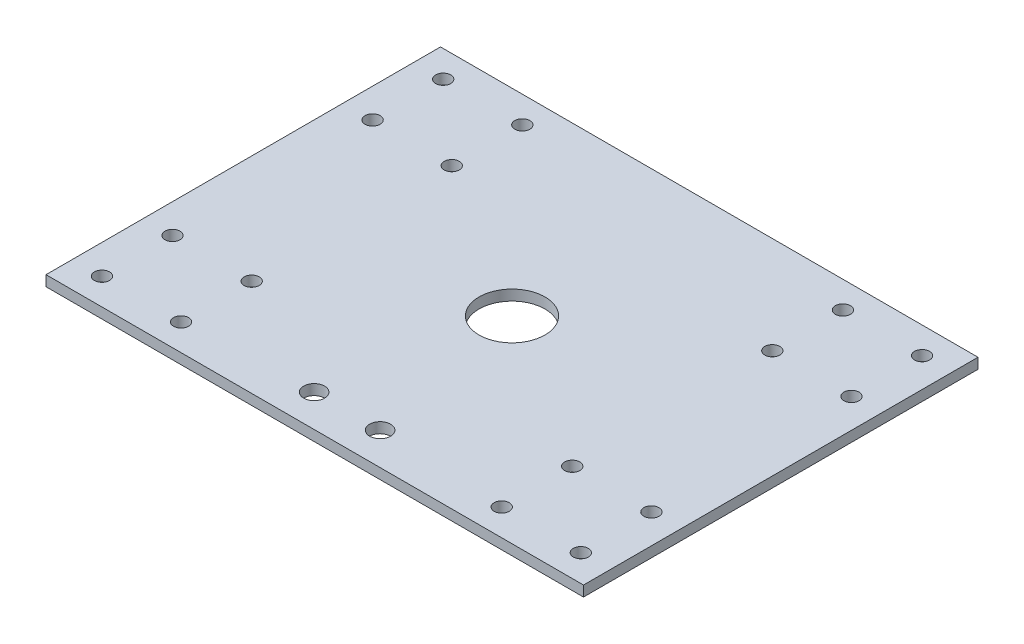
ISO-10303-21;
HEADER;
FILE_DESCRIPTION(('STEP AP214'),'2;1');
FILE_NAME('part.step','',(''),(''),'','','');
FILE_SCHEMA(('AUTOMOTIVE_DESIGN { 1 0 10303 214 1 1 1 1 }'));
ENDSEC;
DATA;
#1=APPLICATION_CONTEXT('core data for automotive mechanical design processes');
#2=APPLICATION_PROTOCOL_DEFINITION('international standard','automotive_design',2000,#1);
#3=PRODUCT_CONTEXT('',#1,'mechanical');
#4=PRODUCT('Part','Part','',(#3));
#5=PRODUCT_RELATED_PRODUCT_CATEGORY('part','',(#4));
#6=PRODUCT_DEFINITION_FORMATION('','',#4);
#7=PRODUCT_DEFINITION_CONTEXT('part definition',#1,'design');
#8=PRODUCT_DEFINITION('design','',#6,#7);
#9=PRODUCT_DEFINITION_SHAPE('','',#8);
#10=(LENGTH_UNIT() NAMED_UNIT(*) SI_UNIT(.MILLI.,.METRE.));
#11=(NAMED_UNIT(*) PLANE_ANGLE_UNIT() SI_UNIT($,.RADIAN.));
#12=(NAMED_UNIT(*) SI_UNIT($,.STERADIAN.) SOLID_ANGLE_UNIT());
#13=UNCERTAINTY_MEASURE_WITH_UNIT(LENGTH_MEASURE(1.E-05),#10,'distance_accuracy_value','');
#14=(GEOMETRIC_REPRESENTATION_CONTEXT(3) GLOBAL_UNCERTAINTY_ASSIGNED_CONTEXT((#13)) GLOBAL_UNIT_ASSIGNED_CONTEXT((#10,
#11,#12)) REPRESENTATION_CONTEXT('',''));
#15=CARTESIAN_POINT('',(0.,0.,0.));
#16=DIRECTION('',(0.,0.,1.));
#17=DIRECTION('',(1.,0.,0.));
#18=AXIS2_PLACEMENT_3D('',#15,#16,#17);
#19=CARTESIAN_POINT('',(81.5,3.175,59.817));
#20=DIRECTION('',(-1.,0.,0.));
#21=DIRECTION('',(0.,0.,1.));
#22=AXIS2_PLACEMENT_3D('',#19,#20,#21);
#23=PLANE('',#22);
#24=DIRECTION('',(0.,0.,-1.));
#25=VECTOR('',#24,1.);
#26=CARTESIAN_POINT('',(81.5,0.,59.817));
#27=LINE('',#26,#25);
#28=CARTESIAN_POINT('',(81.5,0.,59.817));
#29=VERTEX_POINT('',#28);
#30=CARTESIAN_POINT('',(81.5,0.,-59.817));
#31=VERTEX_POINT('',#30);
#32=EDGE_CURVE('E106',#29,#31,#27,.T.);
#33=ORIENTED_EDGE('',*,*,#32,.T.);
#34=DIRECTION('',(0.,-1.,0.));
#35=VECTOR('',#34,1.);
#36=CARTESIAN_POINT('',(81.5,3.175,-59.817));
#37=LINE('',#36,#35);
#38=CARTESIAN_POINT('',(81.5,3.175,-59.817));
#39=VERTEX_POINT('',#38);
#40=EDGE_CURVE('E11',#39,#31,#37,.T.);
#41=ORIENTED_EDGE('',*,*,#40,.F.);
#42=DIRECTION('',(0.,0.,-1.));
#43=VECTOR('',#42,1.);
#44=CARTESIAN_POINT('',(81.5,3.175,59.817));
#45=LINE('',#44,#43);
#46=CARTESIAN_POINT('',(81.5,3.175,59.817));
#47=VERTEX_POINT('',#46);
#48=EDGE_CURVE('E90',#47,#39,#45,.T.);
#49=ORIENTED_EDGE('',*,*,#48,.F.);
#50=DIRECTION('',(0.,-1.,0.));
#51=VECTOR('',#50,1.);
#52=CARTESIAN_POINT('',(81.5,3.175,59.817));
#53=LINE('',#52,#51);
#54=EDGE_CURVE('E102',#47,#29,#53,.T.);
#55=ORIENTED_EDGE('',*,*,#54,.T.);
#56=EDGE_LOOP('',(#33,#41,#49,#55));
#57=FACE_BOUND('',#56,.T.);
#58=ADVANCED_FACE('F38',(#57),#23,.F.);
#59=CARTESIAN_POINT('',(-81.5,3.175,-59.817));
#60=DIRECTION('',(0.,0.,1.));
#61=DIRECTION('',(1.,0.,0.));
#62=AXIS2_PLACEMENT_3D('',#59,#60,#61);
#63=PLANE('',#62);
#64=DIRECTION('',(-1.,0.,0.));
#65=VECTOR('',#64,1.);
#66=CARTESIAN_POINT('',(-81.5,0.,-59.817));
#67=LINE('',#66,#65);
#68=CARTESIAN_POINT('',(-81.5,0.,-59.817));
#69=VERTEX_POINT('',#68);
#70=EDGE_CURVE('E95',#31,#69,#67,.T.);
#71=ORIENTED_EDGE('',*,*,#70,.T.);
#72=DIRECTION('',(0.,-1.,0.));
#73=VECTOR('',#72,1.);
#74=CARTESIAN_POINT('',(-81.5,3.175,-59.817));
#75=LINE('',#74,#73);
#76=CARTESIAN_POINT('',(-81.5,3.175,-59.817));
#77=VERTEX_POINT('',#76);
#78=EDGE_CURVE('E47',#77,#69,#75,.T.);
#79=ORIENTED_EDGE('',*,*,#78,.F.);
#80=DIRECTION('',(-1.,0.,0.));
#81=VECTOR('',#80,1.);
#82=CARTESIAN_POINT('',(-81.5,3.175,-59.817));
#83=LINE('',#82,#81);
#84=EDGE_CURVE('E85',#39,#77,#83,.T.);
#85=ORIENTED_EDGE('',*,*,#84,.F.);
#86=ORIENTED_EDGE('',*,*,#40,.T.);
#87=EDGE_LOOP('',(#71,#79,#85,#86));
#88=FACE_BOUND('',#87,.T.);
#89=ADVANCED_FACE('F94',(#88),#63,.F.);
#90=CARTESIAN_POINT('',(-81.5,3.175,59.817));
#91=DIRECTION('',(1.,0.,0.));
#92=DIRECTION('',(0.,0.,-1.));
#93=AXIS2_PLACEMENT_3D('',#90,#91,#92);
#94=PLANE('',#93);
#95=DIRECTION('',(0.,0.,1.));
#96=VECTOR('',#95,1.);
#97=CARTESIAN_POINT('',(-81.5,0.,59.817));
#98=LINE('',#97,#96);
#99=CARTESIAN_POINT('',(-81.5,0.,59.817));
#100=VERTEX_POINT('',#99);
#101=EDGE_CURVE('E72',#69,#100,#98,.T.);
#102=ORIENTED_EDGE('',*,*,#101,.T.);
#103=DIRECTION('',(0.,-1.,0.));
#104=VECTOR('',#103,1.);
#105=CARTESIAN_POINT('',(-81.5,3.175,59.817));
#106=LINE('',#105,#104);
#107=CARTESIAN_POINT('',(-81.5,3.175,59.817));
#108=VERTEX_POINT('',#107);
#109=EDGE_CURVE('E97',#108,#100,#106,.T.);
#110=ORIENTED_EDGE('',*,*,#109,.F.);
#111=DIRECTION('',(0.,0.,1.));
#112=VECTOR('',#111,1.);
#113=CARTESIAN_POINT('',(-81.5,3.175,59.817));
#114=LINE('',#113,#112);
#115=EDGE_CURVE('E88',#77,#108,#114,.T.);
#116=ORIENTED_EDGE('',*,*,#115,.F.);
#117=ORIENTED_EDGE('',*,*,#78,.T.);
#118=EDGE_LOOP('',(#102,#110,#116,#117));
#119=FACE_BOUND('',#118,.T.);
#120=ADVANCED_FACE('F98',(#119),#94,.F.);
#121=CARTESIAN_POINT('',(-81.5,3.175,59.817));
#122=DIRECTION('',(0.,0.,-1.));
#123=DIRECTION('',(-1.,0.,0.));
#124=AXIS2_PLACEMENT_3D('',#121,#122,#123);
#125=PLANE('',#124);
#126=DIRECTION('',(1.,0.,0.));
#127=VECTOR('',#126,1.);
#128=CARTESIAN_POINT('',(-81.5,0.,59.817));
#129=LINE('',#128,#127);
#130=EDGE_CURVE('E78',#100,#29,#129,.T.);
#131=ORIENTED_EDGE('',*,*,#130,.T.);
#132=ORIENTED_EDGE('',*,*,#54,.F.);
#133=DIRECTION('',(1.,0.,0.));
#134=VECTOR('',#133,1.);
#135=CARTESIAN_POINT('',(-81.5,3.175,59.817));
#136=LINE('',#135,#134);
#137=EDGE_CURVE('E55',#108,#47,#136,.T.);
#138=ORIENTED_EDGE('',*,*,#137,.F.);
#139=ORIENTED_EDGE('',*,*,#109,.T.);
#140=EDGE_LOOP('',(#131,#132,#138,#139));
#141=FACE_BOUND('',#140,.T.);
#142=ADVANCED_FACE('F120',(#141),#125,.F.);
#143=CARTESIAN_POINT('',(0.,3.175,0.));
#144=DIRECTION('',(0.,-1.,0.));
#145=DIRECTION('',(0.,0.,-1.));
#146=AXIS2_PLACEMENT_3D('',#143,#144,#145);
#147=PLANE('',#146);
#148=CARTESIAN_POINT('',(-10.,3.175,50.));
#149=DIRECTION('',(0.,1.,0.));
#150=DIRECTION('',(0.,0.,1.));
#151=AXIS2_PLACEMENT_3D('',#148,#149,#150);
#152=CIRCLE('',#151,3.175);
#153=CARTESIAN_POINT('',(-10.,3.175,53.175));
#154=VERTEX_POINT('',#153);
#155=EDGE_CURVE('E274',#154,#154,#152,.T.);
#156=ORIENTED_EDGE('',*,*,#155,.F.);
#157=EDGE_LOOP('',(#156));
#158=FACE_BOUND('',#157,.T.);
#159=CARTESIAN_POINT('',(10.,3.175,50.));
#160=DIRECTION('',(0.,1.,0.));
#161=DIRECTION('',(0.,0.,1.));
#162=AXIS2_PLACEMENT_3D('',#159,#160,#161);
#163=CIRCLE('',#162,3.175);
#164=CARTESIAN_POINT('',(10.,3.175,53.175));
#165=VERTEX_POINT('',#164);
#166=EDGE_CURVE('E266',#165,#165,#163,.T.);
#167=ORIENTED_EDGE('',*,*,#166,.F.);
#168=EDGE_LOOP('',(#167));
#169=FACE_BOUND('',#168,.T.);
#170=CARTESIAN_POINT('',(0.,3.175,0.));
#171=DIRECTION('',(0.,1.,0.));
#172=DIRECTION('',(0.,0.,1.));
#173=AXIS2_PLACEMENT_3D('',#170,#171,#172);
#174=CIRCLE('',#173,10.);
#175=CARTESIAN_POINT('',(0.,3.175,10.));
#176=VERTEX_POINT('',#175);
#177=EDGE_CURVE('E255',#176,#176,#174,.T.);
#178=ORIENTED_EDGE('',*,*,#177,.F.);
#179=EDGE_LOOP('',(#178));
#180=FACE_BOUND('',#179,.T.);
#181=CARTESIAN_POINT('',(-72.61,3.175,30.3398));
#182=DIRECTION('',(0.,-1.,0.));
#183=DIRECTION('',(0.,0.,1.));
#184=AXIS2_PLACEMENT_3D('',#181,#182,#183);
#185=CIRCLE('',#184,2.28599999999999);
#186=CARTESIAN_POINT('',(-72.61,3.175,32.6258));
#187=VERTEX_POINT('',#186);
#188=EDGE_CURVE('E231',#187,#187,#185,.T.);
#189=ORIENTED_EDGE('',*,*,#188,.T.);
#190=EDGE_LOOP('',(#189));
#191=FACE_BOUND('',#190,.T.);
#192=CARTESIAN_POINT('',(-48.61,3.175,30.3398000000002));
#193=DIRECTION('',(0.,-1.,0.));
#194=DIRECTION('',(0.,0.,1.));
#195=AXIS2_PLACEMENT_3D('',#192,#193,#194);
#196=CIRCLE('',#195,2.286);
#197=CARTESIAN_POINT('',(-48.61,3.175,32.6258000000002));
#198=VERTEX_POINT('',#197);
#199=EDGE_CURVE('E240',#198,#198,#196,.T.);
#200=ORIENTED_EDGE('',*,*,#199,.T.);
#201=EDGE_LOOP('',(#200));
#202=FACE_BOUND('',#201,.T.);
#203=CARTESIAN_POINT('',(-48.61,3.175,51.7398000000002));
#204=DIRECTION('',(0.,-1.,0.));
#205=DIRECTION('',(0.,0.,1.));
#206=AXIS2_PLACEMENT_3D('',#203,#204,#205);
#207=CIRCLE('',#206,2.286);
#208=CARTESIAN_POINT('',(-48.61,3.175,54.0258000000002));
#209=VERTEX_POINT('',#208);
#210=EDGE_CURVE('E248',#209,#209,#207,.T.);
#211=ORIENTED_EDGE('',*,*,#210,.T.);
#212=EDGE_LOOP('',(#211));
#213=FACE_BOUND('',#212,.T.);
#214=CARTESIAN_POINT('',(-72.61,3.175,51.7398));
#215=DIRECTION('',(0.,-1.,0.));
#216=DIRECTION('',(0.,0.,1.));
#217=AXIS2_PLACEMENT_3D('',#214,#215,#216);
#218=CIRCLE('',#217,2.28599999999999);
#219=CARTESIAN_POINT('',(-72.61,3.175,54.0258));
#220=VERTEX_POINT('',#219);
#221=EDGE_CURVE('E223',#220,#220,#218,.T.);
#222=ORIENTED_EDGE('',*,*,#221,.T.);
#223=EDGE_LOOP('',(#222));
#224=FACE_BOUND('',#223,.T.);
#225=CARTESIAN_POINT('',(-72.61,3.175,-30.3398));
#226=DIRECTION('',(0.,1.,0.));
#227=DIRECTION('',(0.,0.,-1.));
#228=AXIS2_PLACEMENT_3D('',#225,#226,#227);
#229=CIRCLE('',#228,2.28599999999999);
#230=CARTESIAN_POINT('',(-72.61,3.175,-32.6258));
#231=VERTEX_POINT('',#230);
#232=EDGE_CURVE('E199',#231,#231,#229,.T.);
#233=ORIENTED_EDGE('',*,*,#232,.F.);
#234=EDGE_LOOP('',(#233));
#235=FACE_BOUND('',#234,.T.);
#236=CARTESIAN_POINT('',(-48.61,3.175,-30.3398000000002));
#237=DIRECTION('',(0.,1.,0.));
#238=DIRECTION('',(0.,0.,-1.));
#239=AXIS2_PLACEMENT_3D('',#236,#237,#238);
#240=CIRCLE('',#239,2.286);
#241=CARTESIAN_POINT('',(-48.61,3.175,-32.6258000000002));
#242=VERTEX_POINT('',#241);
#243=EDGE_CURVE('E208',#242,#242,#240,.T.);
#244=ORIENTED_EDGE('',*,*,#243,.F.);
#245=EDGE_LOOP('',(#244));
#246=FACE_BOUND('',#245,.T.);
#247=CARTESIAN_POINT('',(-48.61,3.175,-51.7398000000002));
#248=DIRECTION('',(0.,1.,0.));
#249=DIRECTION('',(0.,0.,-1.));
#250=AXIS2_PLACEMENT_3D('',#247,#248,#249);
#251=CIRCLE('',#250,2.286);
#252=CARTESIAN_POINT('',(-48.61,3.175,-54.0258000000002));
#253=VERTEX_POINT('',#252);
#254=EDGE_CURVE('E216',#253,#253,#251,.T.);
#255=ORIENTED_EDGE('',*,*,#254,.F.);
#256=EDGE_LOOP('',(#255));
#257=FACE_BOUND('',#256,.T.);
#258=CARTESIAN_POINT('',(-72.61,3.175,-51.7398));
#259=DIRECTION('',(0.,1.,0.));
#260=DIRECTION('',(0.,0.,-1.));
#261=AXIS2_PLACEMENT_3D('',#258,#259,#260);
#262=CIRCLE('',#261,2.28599999999999);
#263=CARTESIAN_POINT('',(-72.61,3.175,-54.0258));
#264=VERTEX_POINT('',#263);
#265=EDGE_CURVE('E191',#264,#264,#262,.T.);
#266=ORIENTED_EDGE('',*,*,#265,.F.);
#267=EDGE_LOOP('',(#266));
#268=FACE_BOUND('',#267,.T.);
#269=CARTESIAN_POINT('',(72.61,3.175,-30.3398));
#270=DIRECTION('',(0.,-1.,0.));
#271=DIRECTION('',(0.,0.,-1.));
#272=AXIS2_PLACEMENT_3D('',#269,#270,#271);
#273=CIRCLE('',#272,2.28599999999999);
#274=CARTESIAN_POINT('',(72.61,3.175,-32.6258));
#275=VERTEX_POINT('',#274);
#276=EDGE_CURVE('E167',#275,#275,#273,.T.);
#277=ORIENTED_EDGE('',*,*,#276,.T.);
#278=EDGE_LOOP('',(#277));
#279=FACE_BOUND('',#278,.T.);
#280=CARTESIAN_POINT('',(48.61,3.175,-30.3398000000002));
#281=DIRECTION('',(0.,-1.,0.));
#282=DIRECTION('',(0.,0.,-1.));
#283=AXIS2_PLACEMENT_3D('',#280,#281,#282);
#284=CIRCLE('',#283,2.286);
#285=CARTESIAN_POINT('',(48.61,3.175,-32.6258000000002));
#286=VERTEX_POINT('',#285);
#287=EDGE_CURVE('E176',#286,#286,#284,.T.);
#288=ORIENTED_EDGE('',*,*,#287,.T.);
#289=EDGE_LOOP('',(#288));
#290=FACE_BOUND('',#289,.T.);
#291=CARTESIAN_POINT('',(48.61,3.175,-51.7398000000002));
#292=DIRECTION('',(0.,-1.,0.));
#293=DIRECTION('',(0.,0.,-1.));
#294=AXIS2_PLACEMENT_3D('',#291,#292,#293);
#295=CIRCLE('',#294,2.286);
#296=CARTESIAN_POINT('',(48.61,3.175,-54.0258000000002));
#297=VERTEX_POINT('',#296);
#298=EDGE_CURVE('E184',#297,#297,#295,.T.);
#299=ORIENTED_EDGE('',*,*,#298,.T.);
#300=EDGE_LOOP('',(#299));
#301=FACE_BOUND('',#300,.T.);
#302=CARTESIAN_POINT('',(72.61,3.175,-51.7398));
#303=DIRECTION('',(0.,-1.,0.));
#304=DIRECTION('',(0.,0.,-1.));
#305=AXIS2_PLACEMENT_3D('',#302,#303,#304);
#306=CIRCLE('',#305,2.28599999999999);
#307=CARTESIAN_POINT('',(72.61,3.175,-54.0258));
#308=VERTEX_POINT('',#307);
#309=EDGE_CURVE('E159',#308,#308,#306,.T.);
#310=ORIENTED_EDGE('',*,*,#309,.T.);
#311=EDGE_LOOP('',(#310));
#312=FACE_BOUND('',#311,.T.);
#313=CARTESIAN_POINT('',(72.61,3.175,30.3398));
#314=DIRECTION('',(0.,1.,0.));
#315=DIRECTION('',(0.,0.,1.));
#316=AXIS2_PLACEMENT_3D('',#313,#314,#315);
#317=CIRCLE('',#316,2.28599999999999);
#318=CARTESIAN_POINT('',(72.61,3.175,32.6258));
#319=VERTEX_POINT('',#318);
#320=EDGE_CURVE('E135',#319,#319,#317,.T.);
#321=ORIENTED_EDGE('',*,*,#320,.F.);
#322=EDGE_LOOP('',(#321));
#323=FACE_BOUND('',#322,.T.);
#324=CARTESIAN_POINT('',(48.61,3.175,30.3398000000002));
#325=DIRECTION('',(0.,1.,0.));
#326=DIRECTION('',(0.,0.,1.));
#327=AXIS2_PLACEMENT_3D('',#324,#325,#326);
#328=CIRCLE('',#327,2.286);
#329=CARTESIAN_POINT('',(48.61,3.175,32.6258000000002));
#330=VERTEX_POINT('',#329);
#331=EDGE_CURVE('E144',#330,#330,#328,.T.);
#332=ORIENTED_EDGE('',*,*,#331,.F.);
#333=EDGE_LOOP('',(#332));
#334=FACE_BOUND('',#333,.T.);
#335=CARTESIAN_POINT('',(48.61,3.175,51.7398000000002));
#336=DIRECTION('',(0.,1.,0.));
#337=DIRECTION('',(0.,0.,1.));
#338=AXIS2_PLACEMENT_3D('',#335,#336,#337);
#339=CIRCLE('',#338,2.286);
#340=CARTESIAN_POINT('',(48.61,3.175,54.0258000000002));
#341=VERTEX_POINT('',#340);
#342=EDGE_CURVE('E152',#341,#341,#339,.T.);
#343=ORIENTED_EDGE('',*,*,#342,.F.);
#344=EDGE_LOOP('',(#343));
#345=FACE_BOUND('',#344,.T.);
#346=CARTESIAN_POINT('',(72.61,3.175,51.7398));
#347=DIRECTION('',(0.,1.,0.));
#348=DIRECTION('',(0.,0.,1.));
#349=AXIS2_PLACEMENT_3D('',#346,#347,#348);
#350=CIRCLE('',#349,2.28599999999999);
#351=CARTESIAN_POINT('',(72.61,3.175,54.0258));
#352=VERTEX_POINT('',#351);
#353=EDGE_CURVE('E127',#352,#352,#350,.T.);
#354=ORIENTED_EDGE('',*,*,#353,.F.);
#355=EDGE_LOOP('',(#354));
#356=FACE_BOUND('',#355,.T.);
#357=ORIENTED_EDGE('',*,*,#48,.T.);
#358=ORIENTED_EDGE('',*,*,#84,.T.);
#359=ORIENTED_EDGE('',*,*,#115,.T.);
#360=ORIENTED_EDGE('',*,*,#137,.T.);
#361=EDGE_LOOP('',(#357,#358,#359,#360));
#362=FACE_BOUND('',#361,.T.);
#363=ADVANCED_FACE('F86',(#158,#169,#180,#191,#202,#213,#224,#235,#246,#257,#268,#279,#290,#301,
#312,#323,#334,#345,#356,#362),#147,.F.);
#364=CARTESIAN_POINT('',(0.,0.,0.));
#365=DIRECTION('',(0.,-1.,0.));
#366=DIRECTION('',(0.,0.,-1.));
#367=AXIS2_PLACEMENT_3D('',#364,#365,#366);
#368=PLANE('',#367);
#369=CARTESIAN_POINT('',(-10.,0.,50.));
#370=DIRECTION('',(0.,1.,0.));
#371=DIRECTION('',(0.,0.,1.));
#372=AXIS2_PLACEMENT_3D('',#369,#370,#371);
#373=CIRCLE('',#372,3.175);
#374=CARTESIAN_POINT('',(-10.,0.,53.175));
#375=VERTEX_POINT('',#374);
#376=EDGE_CURVE('E270',#375,#375,#373,.T.);
#377=ORIENTED_EDGE('',*,*,#376,.T.);
#378=EDGE_LOOP('',(#377));
#379=FACE_BOUND('',#378,.T.);
#380=CARTESIAN_POINT('',(10.,0.,50.));
#381=DIRECTION('',(0.,1.,0.));
#382=DIRECTION('',(0.,0.,1.));
#383=AXIS2_PLACEMENT_3D('',#380,#381,#382);
#384=CIRCLE('',#383,3.175);
#385=CARTESIAN_POINT('',(10.,0.,53.175));
#386=VERTEX_POINT('',#385);
#387=EDGE_CURVE('E259',#386,#386,#384,.T.);
#388=ORIENTED_EDGE('',*,*,#387,.T.);
#389=EDGE_LOOP('',(#388));
#390=FACE_BOUND('',#389,.T.);
#391=CARTESIAN_POINT('',(0.,0.,0.));
#392=DIRECTION('',(0.,1.,0.));
#393=DIRECTION('',(0.,0.,1.));
#394=AXIS2_PLACEMENT_3D('',#391,#392,#393);
#395=CIRCLE('',#394,10.);
#396=CARTESIAN_POINT('',(0.,0.,10.));
#397=VERTEX_POINT('',#396);
#398=EDGE_CURVE('E236',#397,#397,#395,.T.);
#399=ORIENTED_EDGE('',*,*,#398,.T.);
#400=EDGE_LOOP('',(#399));
#401=FACE_BOUND('',#400,.T.);
#402=CARTESIAN_POINT('',(-72.61,0.,30.3398));
#403=DIRECTION('',(0.,-1.,0.));
#404=DIRECTION('',(0.,0.,1.));
#405=AXIS2_PLACEMENT_3D('',#402,#403,#404);
#406=CIRCLE('',#405,2.28599999999999);
#407=CARTESIAN_POINT('',(-72.61,0.,32.6258));
#408=VERTEX_POINT('',#407);
#409=EDGE_CURVE('E235',#408,#408,#406,.T.);
#410=ORIENTED_EDGE('',*,*,#409,.F.);
#411=EDGE_LOOP('',(#410));
#412=FACE_BOUND('',#411,.T.);
#413=CARTESIAN_POINT('',(-48.61,0.,30.3398000000002));
#414=DIRECTION('',(0.,-1.,0.));
#415=DIRECTION('',(0.,0.,1.));
#416=AXIS2_PLACEMENT_3D('',#413,#414,#415);
#417=CIRCLE('',#416,2.286);
#418=CARTESIAN_POINT('',(-48.61,0.,32.6258000000002));
#419=VERTEX_POINT('',#418);
#420=EDGE_CURVE('E244',#419,#419,#417,.T.);
#421=ORIENTED_EDGE('',*,*,#420,.F.);
#422=EDGE_LOOP('',(#421));
#423=FACE_BOUND('',#422,.T.);
#424=CARTESIAN_POINT('',(-48.61,0.,51.7398000000002));
#425=DIRECTION('',(0.,-1.,0.));
#426=DIRECTION('',(0.,0.,1.));
#427=AXIS2_PLACEMENT_3D('',#424,#425,#426);
#428=CIRCLE('',#427,2.286);
#429=CARTESIAN_POINT('',(-48.61,0.,54.0258000000002));
#430=VERTEX_POINT('',#429);
#431=EDGE_CURVE('E227',#430,#430,#428,.T.);
#432=ORIENTED_EDGE('',*,*,#431,.F.);
#433=EDGE_LOOP('',(#432));
#434=FACE_BOUND('',#433,.T.);
#435=CARTESIAN_POINT('',(-72.61,0.,51.7398));
#436=DIRECTION('',(0.,-1.,0.));
#437=DIRECTION('',(0.,0.,1.));
#438=AXIS2_PLACEMENT_3D('',#435,#436,#437);
#439=CIRCLE('',#438,2.28599999999999);
#440=CARTESIAN_POINT('',(-72.61,0.,54.0258));
#441=VERTEX_POINT('',#440);
#442=EDGE_CURVE('E204',#441,#441,#439,.T.);
#443=ORIENTED_EDGE('',*,*,#442,.F.);
#444=EDGE_LOOP('',(#443));
#445=FACE_BOUND('',#444,.T.);
#446=CARTESIAN_POINT('',(-72.61,0.,-30.3398));
#447=DIRECTION('',(0.,1.,0.));
#448=DIRECTION('',(0.,0.,-1.));
#449=AXIS2_PLACEMENT_3D('',#446,#447,#448);
#450=CIRCLE('',#449,2.28599999999999);
#451=CARTESIAN_POINT('',(-72.61,0.,-32.6258));
#452=VERTEX_POINT('',#451);
#453=EDGE_CURVE('E203',#452,#452,#450,.T.);
#454=ORIENTED_EDGE('',*,*,#453,.T.);
#455=EDGE_LOOP('',(#454));
#456=FACE_BOUND('',#455,.T.);
#457=CARTESIAN_POINT('',(-48.61,0.,-30.3398000000002));
#458=DIRECTION('',(0.,1.,0.));
#459=DIRECTION('',(0.,0.,-1.));
#460=AXIS2_PLACEMENT_3D('',#457,#458,#459);
#461=CIRCLE('',#460,2.286);
#462=CARTESIAN_POINT('',(-48.61,0.,-32.6258000000002));
#463=VERTEX_POINT('',#462);
#464=EDGE_CURVE('E212',#463,#463,#461,.T.);
#465=ORIENTED_EDGE('',*,*,#464,.T.);
#466=EDGE_LOOP('',(#465));
#467=FACE_BOUND('',#466,.T.);
#468=CARTESIAN_POINT('',(-48.61,0.,-51.7398000000002));
#469=DIRECTION('',(0.,1.,0.));
#470=DIRECTION('',(0.,0.,-1.));
#471=AXIS2_PLACEMENT_3D('',#468,#469,#470);
#472=CIRCLE('',#471,2.286);
#473=CARTESIAN_POINT('',(-48.61,0.,-54.0258000000002));
#474=VERTEX_POINT('',#473);
#475=EDGE_CURVE('E195',#474,#474,#472,.T.);
#476=ORIENTED_EDGE('',*,*,#475,.T.);
#477=EDGE_LOOP('',(#476));
#478=FACE_BOUND('',#477,.T.);
#479=CARTESIAN_POINT('',(-72.61,0.,-51.7398));
#480=DIRECTION('',(0.,1.,0.));
#481=DIRECTION('',(0.,0.,-1.));
#482=AXIS2_PLACEMENT_3D('',#479,#480,#481);
#483=CIRCLE('',#482,2.28599999999999);
#484=CARTESIAN_POINT('',(-72.61,0.,-54.0258));
#485=VERTEX_POINT('',#484);
#486=EDGE_CURVE('E172',#485,#485,#483,.T.);
#487=ORIENTED_EDGE('',*,*,#486,.T.);
#488=EDGE_LOOP('',(#487));
#489=FACE_BOUND('',#488,.T.);
#490=CARTESIAN_POINT('',(72.61,0.,-30.3398));
#491=DIRECTION('',(0.,-1.,0.));
#492=DIRECTION('',(0.,0.,-1.));
#493=AXIS2_PLACEMENT_3D('',#490,#491,#492);
#494=CIRCLE('',#493,2.28599999999999);
#495=CARTESIAN_POINT('',(72.61,0.,-32.6258));
#496=VERTEX_POINT('',#495);
#497=EDGE_CURVE('E171',#496,#496,#494,.T.);
#498=ORIENTED_EDGE('',*,*,#497,.F.);
#499=EDGE_LOOP('',(#498));
#500=FACE_BOUND('',#499,.T.);
#501=CARTESIAN_POINT('',(48.61,0.,-30.3398000000002));
#502=DIRECTION('',(0.,-1.,0.));
#503=DIRECTION('',(0.,0.,-1.));
#504=AXIS2_PLACEMENT_3D('',#501,#502,#503);
#505=CIRCLE('',#504,2.286);
#506=CARTESIAN_POINT('',(48.61,0.,-32.6258000000002));
#507=VERTEX_POINT('',#506);
#508=EDGE_CURVE('E180',#507,#507,#505,.T.);
#509=ORIENTED_EDGE('',*,*,#508,.F.);
#510=EDGE_LOOP('',(#509));
#511=FACE_BOUND('',#510,.T.);
#512=CARTESIAN_POINT('',(48.61,0.,-51.7398000000002));
#513=DIRECTION('',(0.,-1.,0.));
#514=DIRECTION('',(0.,0.,-1.));
#515=AXIS2_PLACEMENT_3D('',#512,#513,#514);
#516=CIRCLE('',#515,2.286);
#517=CARTESIAN_POINT('',(48.61,0.,-54.0258000000002));
#518=VERTEX_POINT('',#517);
#519=EDGE_CURVE('E163',#518,#518,#516,.T.);
#520=ORIENTED_EDGE('',*,*,#519,.F.);
#521=EDGE_LOOP('',(#520));
#522=FACE_BOUND('',#521,.T.);
#523=CARTESIAN_POINT('',(72.61,0.,-51.7398));
#524=DIRECTION('',(0.,-1.,0.));
#525=DIRECTION('',(0.,0.,-1.));
#526=AXIS2_PLACEMENT_3D('',#523,#524,#525);
#527=CIRCLE('',#526,2.28599999999999);
#528=CARTESIAN_POINT('',(72.61,0.,-54.0258));
#529=VERTEX_POINT('',#528);
#530=EDGE_CURVE('E140',#529,#529,#527,.T.);
#531=ORIENTED_EDGE('',*,*,#530,.F.);
#532=EDGE_LOOP('',(#531));
#533=FACE_BOUND('',#532,.T.);
#534=CARTESIAN_POINT('',(72.61,0.,30.3398));
#535=DIRECTION('',(0.,1.,0.));
#536=DIRECTION('',(0.,0.,1.));
#537=AXIS2_PLACEMENT_3D('',#534,#535,#536);
#538=CIRCLE('',#537,2.28599999999999);
#539=CARTESIAN_POINT('',(72.61,0.,32.6258));
#540=VERTEX_POINT('',#539);
#541=EDGE_CURVE('E139',#540,#540,#538,.T.);
#542=ORIENTED_EDGE('',*,*,#541,.T.);
#543=EDGE_LOOP('',(#542));
#544=FACE_BOUND('',#543,.T.);
#545=CARTESIAN_POINT('',(48.61,0.,30.3398000000002));
#546=DIRECTION('',(0.,1.,0.));
#547=DIRECTION('',(0.,0.,1.));
#548=AXIS2_PLACEMENT_3D('',#545,#546,#547);
#549=CIRCLE('',#548,2.286);
#550=CARTESIAN_POINT('',(48.61,0.,32.6258000000002));
#551=VERTEX_POINT('',#550);
#552=EDGE_CURVE('E148',#551,#551,#549,.T.);
#553=ORIENTED_EDGE('',*,*,#552,.T.);
#554=EDGE_LOOP('',(#553));
#555=FACE_BOUND('',#554,.T.);
#556=CARTESIAN_POINT('',(48.61,0.,51.7398000000002));
#557=DIRECTION('',(0.,1.,0.));
#558=DIRECTION('',(0.,0.,1.));
#559=AXIS2_PLACEMENT_3D('',#556,#557,#558);
#560=CIRCLE('',#559,2.286);
#561=CARTESIAN_POINT('',(48.61,0.,54.0258000000002));
#562=VERTEX_POINT('',#561);
#563=EDGE_CURVE('E131',#562,#562,#560,.T.);
#564=ORIENTED_EDGE('',*,*,#563,.T.);
#565=EDGE_LOOP('',(#564));
#566=FACE_BOUND('',#565,.T.);
#567=CARTESIAN_POINT('',(72.61,0.,51.7398));
#568=DIRECTION('',(0.,1.,0.));
#569=DIRECTION('',(0.,0.,1.));
#570=AXIS2_PLACEMENT_3D('',#567,#568,#569);
#571=CIRCLE('',#570,2.28599999999999);
#572=CARTESIAN_POINT('',(72.61,0.,54.0258));
#573=VERTEX_POINT('',#572);
#574=EDGE_CURVE('E110',#573,#573,#571,.T.);
#575=ORIENTED_EDGE('',*,*,#574,.T.);
#576=EDGE_LOOP('',(#575));
#577=FACE_BOUND('',#576,.T.);
#578=ORIENTED_EDGE('',*,*,#32,.F.);
#579=ORIENTED_EDGE('',*,*,#130,.F.);
#580=ORIENTED_EDGE('',*,*,#101,.F.);
#581=ORIENTED_EDGE('',*,*,#70,.F.);
#582=EDGE_LOOP('',(#578,#579,#580,#581));
#583=FACE_BOUND('',#582,.T.);
#584=ADVANCED_FACE('F123',(#379,#390,#401,#412,#423,#434,#445,#456,#467,#478,#489,#500,#511,
#522,#533,#544,#555,#566,#577,#583),#368,.T.);
#585=CARTESIAN_POINT('',(72.61,0.,51.7398));
#586=DIRECTION('',(0.,1.,0.));
#587=DIRECTION('',(0.,0.,1.));
#588=AXIS2_PLACEMENT_3D('',#585,#586,#587);
#589=CYLINDRICAL_SURFACE('',#588,2.28599999999999);
#590=ORIENTED_EDGE('',*,*,#574,.F.);
#591=EDGE_LOOP('',(#590));
#592=FACE_BOUND('',#591,.T.);
#593=ORIENTED_EDGE('',*,*,#353,.T.);
#594=EDGE_LOOP('',(#593));
#595=FACE_BOUND('',#594,.T.);
#596=ADVANCED_FACE('F320',(#592,#595),#589,.F.);
#597=CARTESIAN_POINT('',(48.61,0.,51.7398000000002));
#598=DIRECTION('',(0.,1.,0.));
#599=DIRECTION('',(0.,0.,1.));
#600=AXIS2_PLACEMENT_3D('',#597,#598,#599);
#601=CYLINDRICAL_SURFACE('',#600,2.286);
#602=ORIENTED_EDGE('',*,*,#563,.F.);
#603=EDGE_LOOP('',(#602));
#604=FACE_BOUND('',#603,.T.);
#605=ORIENTED_EDGE('',*,*,#342,.T.);
#606=EDGE_LOOP('',(#605));
#607=FACE_BOUND('',#606,.T.);
#608=ADVANCED_FACE('F322',(#604,#607),#601,.F.);
#609=CARTESIAN_POINT('',(48.61,0.,30.3398000000002));
#610=DIRECTION('',(0.,1.,0.));
#611=DIRECTION('',(0.,0.,1.));
#612=AXIS2_PLACEMENT_3D('',#609,#610,#611);
#613=CYLINDRICAL_SURFACE('',#612,2.286);
#614=ORIENTED_EDGE('',*,*,#552,.F.);
#615=EDGE_LOOP('',(#614));
#616=FACE_BOUND('',#615,.T.);
#617=ORIENTED_EDGE('',*,*,#331,.T.);
#618=EDGE_LOOP('',(#617));
#619=FACE_BOUND('',#618,.T.);
#620=ADVANCED_FACE('F329',(#616,#619),#613,.F.);
#621=CARTESIAN_POINT('',(72.61,0.,30.3398));
#622=DIRECTION('',(0.,1.,0.));
#623=DIRECTION('',(0.,0.,1.));
#624=AXIS2_PLACEMENT_3D('',#621,#622,#623);
#625=CYLINDRICAL_SURFACE('',#624,2.28599999999999);
#626=ORIENTED_EDGE('',*,*,#541,.F.);
#627=EDGE_LOOP('',(#626));
#628=FACE_BOUND('',#627,.T.);
#629=ORIENTED_EDGE('',*,*,#320,.T.);
#630=EDGE_LOOP('',(#629));
#631=FACE_BOUND('',#630,.T.);
#632=ADVANCED_FACE('F436',(#628,#631),#625,.F.);
#633=CARTESIAN_POINT('',(72.61,0.,-51.7398));
#634=DIRECTION('',(0.,1.,0.));
#635=DIRECTION('',(0.,0.,1.));
#636=AXIS2_PLACEMENT_3D('',#633,#634,#635);
#637=CYLINDRICAL_SURFACE('',#636,2.28599999999999);
#638=ORIENTED_EDGE('',*,*,#530,.T.);
#639=EDGE_LOOP('',(#638));
#640=FACE_BOUND('',#639,.T.);
#641=ORIENTED_EDGE('',*,*,#309,.F.);
#642=EDGE_LOOP('',(#641));
#643=FACE_BOUND('',#642,.T.);
#644=ADVANCED_FACE('F427',(#640,#643),#637,.F.);
#645=CARTESIAN_POINT('',(48.61,0.,-51.7398000000002));
#646=DIRECTION('',(0.,1.,0.));
#647=DIRECTION('',(0.,0.,1.));
#648=AXIS2_PLACEMENT_3D('',#645,#646,#647);
#649=CYLINDRICAL_SURFACE('',#648,2.286);
#650=ORIENTED_EDGE('',*,*,#519,.T.);
#651=EDGE_LOOP('',(#650));
#652=FACE_BOUND('',#651,.T.);
#653=ORIENTED_EDGE('',*,*,#298,.F.);
#654=EDGE_LOOP('',(#653));
#655=FACE_BOUND('',#654,.T.);
#656=ADVANCED_FACE('F423',(#652,#655),#649,.F.);
#657=CARTESIAN_POINT('',(48.61,0.,-30.3398000000002));
#658=DIRECTION('',(0.,1.,0.));
#659=DIRECTION('',(0.,0.,1.));
#660=AXIS2_PLACEMENT_3D('',#657,#658,#659);
#661=CYLINDRICAL_SURFACE('',#660,2.286);
#662=ORIENTED_EDGE('',*,*,#508,.T.);
#663=EDGE_LOOP('',(#662));
#664=FACE_BOUND('',#663,.T.);
#665=ORIENTED_EDGE('',*,*,#287,.F.);
#666=EDGE_LOOP('',(#665));
#667=FACE_BOUND('',#666,.T.);
#668=ADVANCED_FACE('F426',(#664,#667),#661,.F.);
#669=CARTESIAN_POINT('',(72.61,0.,-30.3398));
#670=DIRECTION('',(0.,1.,0.));
#671=DIRECTION('',(0.,0.,1.));
#672=AXIS2_PLACEMENT_3D('',#669,#670,#671);
#673=CYLINDRICAL_SURFACE('',#672,2.28599999999999);
#674=ORIENTED_EDGE('',*,*,#497,.T.);
#675=EDGE_LOOP('',(#674));
#676=FACE_BOUND('',#675,.T.);
#677=ORIENTED_EDGE('',*,*,#276,.F.);
#678=EDGE_LOOP('',(#677));
#679=FACE_BOUND('',#678,.T.);
#680=ADVANCED_FACE('F421',(#676,#679),#673,.F.);
#681=CARTESIAN_POINT('',(-72.61,0.,-51.7398));
#682=DIRECTION('',(0.,1.,0.));
#683=DIRECTION('',(0.,0.,1.));
#684=AXIS2_PLACEMENT_3D('',#681,#682,#683);
#685=CYLINDRICAL_SURFACE('',#684,2.28599999999999);
#686=ORIENTED_EDGE('',*,*,#486,.F.);
#687=EDGE_LOOP('',(#686));
#688=FACE_BOUND('',#687,.T.);
#689=ORIENTED_EDGE('',*,*,#265,.T.);
#690=EDGE_LOOP('',(#689));
#691=FACE_BOUND('',#690,.T.);
#692=ADVANCED_FACE('F411',(#688,#691),#685,.F.);
#693=CARTESIAN_POINT('',(-48.61,0.,-51.7398000000002));
#694=DIRECTION('',(0.,1.,0.));
#695=DIRECTION('',(0.,0.,1.));
#696=AXIS2_PLACEMENT_3D('',#693,#694,#695);
#697=CYLINDRICAL_SURFACE('',#696,2.286);
#698=ORIENTED_EDGE('',*,*,#475,.F.);
#699=EDGE_LOOP('',(#698));
#700=FACE_BOUND('',#699,.T.);
#701=ORIENTED_EDGE('',*,*,#254,.T.);
#702=EDGE_LOOP('',(#701));
#703=FACE_BOUND('',#702,.T.);
#704=ADVANCED_FACE('F407',(#700,#703),#697,.F.);
#705=CARTESIAN_POINT('',(-48.61,0.,-30.3398000000002));
#706=DIRECTION('',(0.,1.,0.));
#707=DIRECTION('',(0.,0.,1.));
#708=AXIS2_PLACEMENT_3D('',#705,#706,#707);
#709=CYLINDRICAL_SURFACE('',#708,2.286);
#710=ORIENTED_EDGE('',*,*,#464,.F.);
#711=EDGE_LOOP('',(#710));
#712=FACE_BOUND('',#711,.T.);
#713=ORIENTED_EDGE('',*,*,#243,.T.);
#714=EDGE_LOOP('',(#713));
#715=FACE_BOUND('',#714,.T.);
#716=ADVANCED_FACE('F410',(#712,#715),#709,.F.);
#717=CARTESIAN_POINT('',(-72.61,0.,-30.3398));
#718=DIRECTION('',(0.,1.,0.));
#719=DIRECTION('',(0.,0.,1.));
#720=AXIS2_PLACEMENT_3D('',#717,#718,#719);
#721=CYLINDRICAL_SURFACE('',#720,2.28599999999999);
#722=ORIENTED_EDGE('',*,*,#453,.F.);
#723=EDGE_LOOP('',(#722));
#724=FACE_BOUND('',#723,.T.);
#725=ORIENTED_EDGE('',*,*,#232,.T.);
#726=EDGE_LOOP('',(#725));
#727=FACE_BOUND('',#726,.T.);
#728=ADVANCED_FACE('F405',(#724,#727),#721,.F.);
#729=CARTESIAN_POINT('',(-72.61,0.,51.7398));
#730=DIRECTION('',(0.,1.,0.));
#731=DIRECTION('',(0.,0.,1.));
#732=AXIS2_PLACEMENT_3D('',#729,#730,#731);
#733=CYLINDRICAL_SURFACE('',#732,2.28599999999999);
#734=ORIENTED_EDGE('',*,*,#442,.T.);
#735=EDGE_LOOP('',(#734));
#736=FACE_BOUND('',#735,.T.);
#737=ORIENTED_EDGE('',*,*,#221,.F.);
#738=EDGE_LOOP('',(#737));
#739=FACE_BOUND('',#738,.T.);
#740=ADVANCED_FACE('F395',(#736,#739),#733,.F.);
#741=CARTESIAN_POINT('',(-48.61,0.,51.7398000000002));
#742=DIRECTION('',(0.,1.,0.));
#743=DIRECTION('',(0.,0.,1.));
#744=AXIS2_PLACEMENT_3D('',#741,#742,#743);
#745=CYLINDRICAL_SURFACE('',#744,2.286);
#746=ORIENTED_EDGE('',*,*,#431,.T.);
#747=EDGE_LOOP('',(#746));
#748=FACE_BOUND('',#747,.T.);
#749=ORIENTED_EDGE('',*,*,#210,.F.);
#750=EDGE_LOOP('',(#749));
#751=FACE_BOUND('',#750,.T.);
#752=ADVANCED_FACE('F391',(#748,#751),#745,.F.);
#753=CARTESIAN_POINT('',(-48.61,0.,30.3398000000002));
#754=DIRECTION('',(0.,1.,0.));
#755=DIRECTION('',(0.,0.,1.));
#756=AXIS2_PLACEMENT_3D('',#753,#754,#755);
#757=CYLINDRICAL_SURFACE('',#756,2.286);
#758=ORIENTED_EDGE('',*,*,#420,.T.);
#759=EDGE_LOOP('',(#758));
#760=FACE_BOUND('',#759,.T.);
#761=ORIENTED_EDGE('',*,*,#199,.F.);
#762=EDGE_LOOP('',(#761));
#763=FACE_BOUND('',#762,.T.);
#764=ADVANCED_FACE('F394',(#760,#763),#757,.F.);
#765=CARTESIAN_POINT('',(-72.61,0.,30.3398));
#766=DIRECTION('',(0.,1.,0.));
#767=DIRECTION('',(0.,0.,1.));
#768=AXIS2_PLACEMENT_3D('',#765,#766,#767);
#769=CYLINDRICAL_SURFACE('',#768,2.28599999999999);
#770=ORIENTED_EDGE('',*,*,#409,.T.);
#771=EDGE_LOOP('',(#770));
#772=FACE_BOUND('',#771,.T.);
#773=ORIENTED_EDGE('',*,*,#188,.F.);
#774=EDGE_LOOP('',(#773));
#775=FACE_BOUND('',#774,.T.);
#776=ADVANCED_FACE('F389',(#772,#775),#769,.F.);
#777=CARTESIAN_POINT('',(0.,0.,0.));
#778=DIRECTION('',(0.,1.,0.));
#779=DIRECTION('',(0.,0.,1.));
#780=AXIS2_PLACEMENT_3D('',#777,#778,#779);
#781=CYLINDRICAL_SURFACE('',#780,10.);
#782=ORIENTED_EDGE('',*,*,#398,.F.);
#783=EDGE_LOOP('',(#782));
#784=FACE_BOUND('',#783,.T.);
#785=ORIENTED_EDGE('',*,*,#177,.T.);
#786=EDGE_LOOP('',(#785));
#787=FACE_BOUND('',#786,.T.);
#788=ADVANCED_FACE('F370',(#784,#787),#781,.F.);
#789=CARTESIAN_POINT('',(10.,3.175,50.));
#790=DIRECTION('',(0.,1.,0.));
#791=DIRECTION('',(0.,0.,1.));
#792=AXIS2_PLACEMENT_3D('',#789,#790,#791);
#793=CYLINDRICAL_SURFACE('',#792,3.175);
#794=ORIENTED_EDGE('',*,*,#387,.F.);
#795=EDGE_LOOP('',(#794));
#796=FACE_BOUND('',#795,.T.);
#797=ORIENTED_EDGE('',*,*,#166,.T.);
#798=EDGE_LOOP('',(#797));
#799=FACE_BOUND('',#798,.T.);
#800=ADVANCED_FACE('F365',(#796,#799),#793,.F.);
#801=CARTESIAN_POINT('',(-10.,3.175,50.));
#802=DIRECTION('',(0.,1.,0.));
#803=DIRECTION('',(0.,0.,1.));
#804=AXIS2_PLACEMENT_3D('',#801,#802,#803);
#805=CYLINDRICAL_SURFACE('',#804,3.175);
#806=ORIENTED_EDGE('',*,*,#376,.F.);
#807=EDGE_LOOP('',(#806));
#808=FACE_BOUND('',#807,.T.);
#809=ORIENTED_EDGE('',*,*,#155,.T.);
#810=EDGE_LOOP('',(#809));
#811=FACE_BOUND('',#810,.T.);
#812=ADVANCED_FACE('F279',(#808,#811),#805,.F.);
#813=CLOSED_SHELL('',(#58,#89,#120,#142,#363,#584,#596,#608,#620,#632,#644,#656,#668,#680,#692,
#704,#716,#728,#740,#752,#764,#776,#788,#800,#812));
#814=MANIFOLD_SOLID_BREP('B2',#813);
#815=ADVANCED_BREP_SHAPE_REPRESENTATION('',(#18,#814),#14);
#816=SHAPE_DEFINITION_REPRESENTATION(#9,#815);
ENDSEC;
END-ISO-10303-21;
